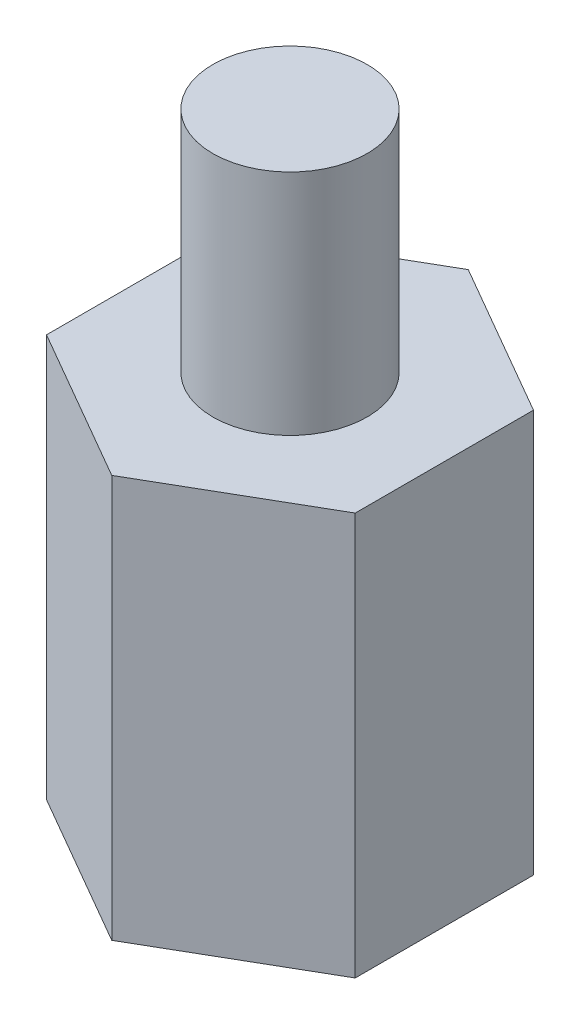
ISO-10303-21;
HEADER;
FILE_DESCRIPTION(('STEP AP214'),'2;1');
FILE_NAME('part.step','',(''),(''),'','','');
FILE_SCHEMA(('AUTOMOTIVE_DESIGN { 1 0 10303 214 1 1 1 1 }'));
ENDSEC;
DATA;
#1=APPLICATION_CONTEXT('core data for automotive mechanical design processes');
#2=APPLICATION_PROTOCOL_DEFINITION('international standard','automotive_design',2000,#1);
#3=PRODUCT_CONTEXT('',#1,'mechanical');
#4=PRODUCT('Part','Part','',(#3));
#5=PRODUCT_RELATED_PRODUCT_CATEGORY('part','',(#4));
#6=PRODUCT_DEFINITION_FORMATION('','',#4);
#7=PRODUCT_DEFINITION_CONTEXT('part definition',#1,'design');
#8=PRODUCT_DEFINITION('design','',#6,#7);
#9=PRODUCT_DEFINITION_SHAPE('','',#8);
#10=(LENGTH_UNIT() NAMED_UNIT(*) SI_UNIT(.MILLI.,.METRE.));
#11=(NAMED_UNIT(*) PLANE_ANGLE_UNIT() SI_UNIT($,.RADIAN.));
#12=(NAMED_UNIT(*) SI_UNIT($,.STERADIAN.) SOLID_ANGLE_UNIT());
#13=UNCERTAINTY_MEASURE_WITH_UNIT(LENGTH_MEASURE(1.E-05),#10,'distance_accuracy_value','');
#14=(GEOMETRIC_REPRESENTATION_CONTEXT(3) GLOBAL_UNCERTAINTY_ASSIGNED_CONTEXT((#13)) GLOBAL_UNIT_ASSIGNED_CONTEXT((#10,
#11,#12)) REPRESENTATION_CONTEXT('',''));
#15=CARTESIAN_POINT('',(0.,0.,0.));
#16=DIRECTION('',(0.,0.,1.));
#17=DIRECTION('',(1.,0.,0.));
#18=AXIS2_PLACEMENT_3D('',#15,#16,#17);
#19=CARTESIAN_POINT('',(2.29999999999999,6.,-1.32790561913617));
#20=DIRECTION('',(-0.499999999999995,0.,0.866025403784441));
#21=DIRECTION('',(0.866025403784442,0.,0.499999999999995));
#22=AXIS2_PLACEMENT_3D('',#19,#20,#21);
#23=PLANE('',#22);
#24=DIRECTION('',(-0.866025403784442,0.,-0.499999999999995));
#25=VECTOR('',#24,1.);
#26=CARTESIAN_POINT('',(2.29999999999999,0.,-1.32790561913617));
#27=LINE('',#26,#25);
#28=CARTESIAN_POINT('',(2.29999999999999,0.,-1.32790561913617));
#29=VERTEX_POINT('',#28);
#30=CARTESIAN_POINT('',(0.,0.,-2.65581123827228));
#31=VERTEX_POINT('',#30);
#32=EDGE_CURVE('E118',#29,#31,#27,.T.);
#33=ORIENTED_EDGE('',*,*,#32,.T.);
#34=DIRECTION('',(0.,-1.,0.));
#35=VECTOR('',#34,1.);
#36=CARTESIAN_POINT('',(0.,6.,-2.65581123827228));
#37=LINE('',#36,#35);
#38=CARTESIAN_POINT('',(0.,6.,-2.65581123827228));
#39=VERTEX_POINT('',#38);
#40=EDGE_CURVE('E11',#39,#31,#37,.T.);
#41=ORIENTED_EDGE('',*,*,#40,.F.);
#42=DIRECTION('',(-0.866025403784442,0.,-0.499999999999995));
#43=VECTOR('',#42,1.);
#44=CARTESIAN_POINT('',(2.29999999999999,6.,-1.32790561913617));
#45=LINE('',#44,#43);
#46=CARTESIAN_POINT('',(2.29999999999999,6.,-1.32790561913617));
#47=VERTEX_POINT('',#46);
#48=EDGE_CURVE('E129',#47,#39,#45,.T.);
#49=ORIENTED_EDGE('',*,*,#48,.F.);
#50=DIRECTION('',(0.,-1.,0.));
#51=VECTOR('',#50,1.);
#52=CARTESIAN_POINT('',(2.29999999999999,6.,-1.32790561913617));
#53=LINE('',#52,#51);
#54=EDGE_CURVE('E114',#47,#29,#53,.T.);
#55=ORIENTED_EDGE('',*,*,#54,.T.);
#56=EDGE_LOOP('',(#33,#41,#49,#55));
#57=FACE_BOUND('',#56,.T.);
#58=ADVANCED_FACE('F34',(#57),#23,.F.);
#59=CARTESIAN_POINT('',(0.,6.,-2.65581123827228));
#60=DIRECTION('',(0.500000000000001,0.,0.866025403784438));
#61=DIRECTION('',(0.866025403784438,0.,-0.500000000000001));
#62=AXIS2_PLACEMENT_3D('',#59,#60,#61);
#63=PLANE('',#62);
#64=DIRECTION('',(-0.866025403784438,0.,0.500000000000001));
#65=VECTOR('',#64,1.);
#66=CARTESIAN_POINT('',(0.,0.,-2.65581123827228));
#67=LINE('',#66,#65);
#68=CARTESIAN_POINT('',(-2.3,0.,-1.32790561913613));
#69=VERTEX_POINT('',#68);
#70=EDGE_CURVE('E121',#31,#69,#67,.T.);
#71=ORIENTED_EDGE('',*,*,#70,.T.);
#72=DIRECTION('',(0.,-1.,0.));
#73=VECTOR('',#72,1.);
#74=CARTESIAN_POINT('',(-2.3,6.,-1.32790561913613));
#75=LINE('',#74,#73);
#76=CARTESIAN_POINT('',(-2.3,6.,-1.32790561913613));
#77=VERTEX_POINT('',#76);
#78=EDGE_CURVE('E42',#77,#69,#75,.T.);
#79=ORIENTED_EDGE('',*,*,#78,.F.);
#80=DIRECTION('',(-0.866025403784438,0.,0.500000000000001));
#81=VECTOR('',#80,1.);
#82=CARTESIAN_POINT('',(0.,6.,-2.65581123827228));
#83=LINE('',#82,#81);
#84=EDGE_CURVE('E87',#39,#77,#83,.T.);
#85=ORIENTED_EDGE('',*,*,#84,.F.);
#86=ORIENTED_EDGE('',*,*,#40,.T.);
#87=EDGE_LOOP('',(#71,#79,#85,#86));
#88=FACE_BOUND('',#87,.T.);
#89=ADVANCED_FACE('F154',(#88),#63,.F.);
#90=CARTESIAN_POINT('',(-2.3,6.,-1.32790561913613));
#91=DIRECTION('',(1.,0.,0.));
#92=DIRECTION('',(0.,0.,-1.));
#93=AXIS2_PLACEMENT_3D('',#90,#91,#92);
#94=PLANE('',#93);
#95=DIRECTION('',(0.,0.,1.));
#96=VECTOR('',#95,1.);
#97=CARTESIAN_POINT('',(-2.3,0.,-1.32790561913613));
#98=LINE('',#97,#96);
#99=CARTESIAN_POINT('',(-2.3,0.,1.32790561913615));
#100=VERTEX_POINT('',#99);
#101=EDGE_CURVE('E124',#69,#100,#98,.T.);
#102=ORIENTED_EDGE('',*,*,#101,.T.);
#103=DIRECTION('',(0.,-1.,0.));
#104=VECTOR('',#103,1.);
#105=CARTESIAN_POINT('',(-2.3,6.,1.32790561913615));
#106=LINE('',#105,#104);
#107=CARTESIAN_POINT('',(-2.3,6.,1.32790561913615));
#108=VERTEX_POINT('',#107);
#109=EDGE_CURVE('E109',#108,#100,#106,.T.);
#110=ORIENTED_EDGE('',*,*,#109,.F.);
#111=DIRECTION('',(0.,0.,1.));
#112=VECTOR('',#111,1.);
#113=CARTESIAN_POINT('',(-2.3,6.,-1.32790561913613));
#114=LINE('',#113,#112);
#115=EDGE_CURVE('E100',#77,#108,#114,.T.);
#116=ORIENTED_EDGE('',*,*,#115,.F.);
#117=ORIENTED_EDGE('',*,*,#78,.T.);
#118=EDGE_LOOP('',(#102,#110,#116,#117));
#119=FACE_BOUND('',#118,.T.);
#120=ADVANCED_FACE('F135',(#119),#94,.F.);
#121=CARTESIAN_POINT('',(-2.3,6.,1.32790561913615));
#122=DIRECTION('',(0.499999999999995,0.,-0.866025403784442));
#123=DIRECTION('',(-0.866025403784442,0.,-0.499999999999995));
#124=AXIS2_PLACEMENT_3D('',#121,#122,#123);
#125=PLANE('',#124);
#126=DIRECTION('',(0.866025403784441,0.,0.499999999999995));
#127=VECTOR('',#126,1.);
#128=CARTESIAN_POINT('',(-2.3,0.,1.32790561913615));
#129=LINE('',#128,#127);
#130=CARTESIAN_POINT('',(0.,0.,2.65581123827228));
#131=VERTEX_POINT('',#130);
#132=EDGE_CURVE('E108',#100,#131,#129,.T.);
#133=ORIENTED_EDGE('',*,*,#132,.T.);
#134=DIRECTION('',(0.,-1.,0.));
#135=VECTOR('',#134,1.);
#136=CARTESIAN_POINT('',(0.,6.,2.65581123827228));
#137=LINE('',#136,#135);
#138=CARTESIAN_POINT('',(0.,6.,2.65581123827228));
#139=VERTEX_POINT('',#138);
#140=EDGE_CURVE('E105',#139,#131,#137,.T.);
#141=ORIENTED_EDGE('',*,*,#140,.F.);
#142=DIRECTION('',(0.866025403784441,0.,0.499999999999995));
#143=VECTOR('',#142,1.);
#144=CARTESIAN_POINT('',(-2.3,6.,1.32790561913615));
#145=LINE('',#144,#143);
#146=EDGE_CURVE('E94',#108,#139,#145,.T.);
#147=ORIENTED_EDGE('',*,*,#146,.F.);
#148=ORIENTED_EDGE('',*,*,#109,.T.);
#149=EDGE_LOOP('',(#133,#141,#147,#148));
#150=FACE_BOUND('',#149,.T.);
#151=ADVANCED_FACE('F106',(#150),#125,.F.);
#152=CARTESIAN_POINT('',(0.,6.,2.65581123827228));
#153=DIRECTION('',(-0.500000000000007,0.,-0.866025403784435));
#154=DIRECTION('',(-0.866025403784434,0.,0.500000000000007));
#155=AXIS2_PLACEMENT_3D('',#152,#153,#154);
#156=PLANE('',#155);
#157=DIRECTION('',(0.866025403784435,0.,-0.500000000000007));
#158=VECTOR('',#157,1.);
#159=CARTESIAN_POINT('',(0.,0.,2.65581123827228));
#160=LINE('',#159,#158);
#161=CARTESIAN_POINT('',(2.30000000000001,0.,1.32790561913612));
#162=VERTEX_POINT('',#161);
#163=EDGE_CURVE('E73',#131,#162,#160,.T.);
#164=ORIENTED_EDGE('',*,*,#163,.T.);
#165=DIRECTION('',(0.,-1.,0.));
#166=VECTOR('',#165,1.);
#167=CARTESIAN_POINT('',(2.30000000000001,6.,1.32790561913612));
#168=LINE('',#167,#166);
#169=CARTESIAN_POINT('',(2.30000000000001,6.,1.32790561913612));
#170=VERTEX_POINT('',#169);
#171=EDGE_CURVE('E110',#170,#162,#168,.T.);
#172=ORIENTED_EDGE('',*,*,#171,.F.);
#173=DIRECTION('',(0.866025403784435,0.,-0.500000000000007));
#174=VECTOR('',#173,1.);
#175=CARTESIAN_POINT('',(0.,6.,2.65581123827228));
#176=LINE('',#175,#174);
#177=EDGE_CURVE('E98',#139,#170,#176,.T.);
#178=ORIENTED_EDGE('',*,*,#177,.F.);
#179=ORIENTED_EDGE('',*,*,#140,.T.);
#180=EDGE_LOOP('',(#164,#172,#178,#179));
#181=FACE_BOUND('',#180,.T.);
#182=ADVANCED_FACE('F112',(#181),#156,.F.);
#183=CARTESIAN_POINT('',(2.30000000000001,6.,1.32790561913612));
#184=DIRECTION('',(-1.,0.,0.));
#185=DIRECTION('',(0.,0.,1.));
#186=AXIS2_PLACEMENT_3D('',#183,#184,#185);
#187=PLANE('',#186);
#188=DIRECTION('',(0.,0.,-1.));
#189=VECTOR('',#188,1.);
#190=CARTESIAN_POINT('',(2.30000000000001,0.,1.32790561913612));
#191=LINE('',#190,#189);
#192=EDGE_CURVE('E79',#162,#29,#191,.T.);
#193=ORIENTED_EDGE('',*,*,#192,.T.);
#194=ORIENTED_EDGE('',*,*,#54,.F.);
#195=DIRECTION('',(0.,0.,-1.));
#196=VECTOR('',#195,1.);
#197=CARTESIAN_POINT('',(2.30000000000001,6.,1.32790561913612));
#198=LINE('',#197,#196);
#199=EDGE_CURVE('E50',#170,#47,#198,.T.);
#200=ORIENTED_EDGE('',*,*,#199,.F.);
#201=ORIENTED_EDGE('',*,*,#171,.T.);
#202=EDGE_LOOP('',(#193,#194,#200,#201));
#203=FACE_BOUND('',#202,.T.);
#204=ADVANCED_FACE('F142',(#203),#187,.F.);
#205=CARTESIAN_POINT('',(0.,6.,0.));
#206=DIRECTION('',(0.,1.,0.));
#207=DIRECTION('',(0.,0.,1.));
#208=AXIS2_PLACEMENT_3D('',#205,#206,#207);
#209=PLANE('',#208);
#210=CARTESIAN_POINT('',(0.,6.,0.));
#211=DIRECTION('',(0.,1.,0.));
#212=DIRECTION('',(0.,0.,1.));
#213=AXIS2_PLACEMENT_3D('',#210,#211,#212);
#214=CIRCLE('',#213,1.15);
#215=CARTESIAN_POINT('',(0.,6.,1.15));
#216=VERTEX_POINT('',#215);
#217=EDGE_CURVE('E237',#216,#216,#214,.T.);
#218=ORIENTED_EDGE('',*,*,#217,.F.);
#219=EDGE_LOOP('',(#218));
#220=FACE_BOUND('',#219,.T.);
#221=ORIENTED_EDGE('',*,*,#48,.T.);
#222=ORIENTED_EDGE('',*,*,#84,.T.);
#223=ORIENTED_EDGE('',*,*,#115,.T.);
#224=ORIENTED_EDGE('',*,*,#146,.T.);
#225=ORIENTED_EDGE('',*,*,#177,.T.);
#226=ORIENTED_EDGE('',*,*,#199,.T.);
#227=EDGE_LOOP('',(#221,#222,#223,#224,#225,#226));
#228=FACE_BOUND('',#227,.T.);
#229=ADVANCED_FACE('F96',(#220,#228),#209,.T.);
#230=CARTESIAN_POINT('',(0.,0.,0.));
#231=DIRECTION('',(0.,1.,0.));
#232=DIRECTION('',(0.,0.,1.));
#233=AXIS2_PLACEMENT_3D('',#230,#231,#232);
#234=PLANE('',#233);
#235=CARTESIAN_POINT('',(0.,0.,0.));
#236=DIRECTION('',(0.,-1.,0.));
#237=DIRECTION('',(0.,0.,-1.));
#238=AXIS2_PLACEMENT_3D('',#235,#236,#237);
#239=CIRCLE('',#238,1.35);
#240=CARTESIAN_POINT('',(0.,0.,-1.35));
#241=VERTEX_POINT('',#240);
#242=EDGE_CURVE('E238',#241,#241,#239,.T.);
#243=ORIENTED_EDGE('',*,*,#242,.F.);
#244=EDGE_LOOP('',(#243));
#245=FACE_BOUND('',#244,.T.);
#246=ORIENTED_EDGE('',*,*,#32,.F.);
#247=ORIENTED_EDGE('',*,*,#192,.F.);
#248=ORIENTED_EDGE('',*,*,#163,.F.);
#249=ORIENTED_EDGE('',*,*,#132,.F.);
#250=ORIENTED_EDGE('',*,*,#101,.F.);
#251=ORIENTED_EDGE('',*,*,#70,.F.);
#252=EDGE_LOOP('',(#246,#247,#248,#249,#250,#251));
#253=FACE_BOUND('',#252,.T.);
#254=ADVANCED_FACE('F138',(#245,#253),#234,.F.);
#255=CARTESIAN_POINT('',(0.,9.4,0.));
#256=DIRECTION('',(0.,-1.,0.));
#257=DIRECTION('',(0.,0.,-1.));
#258=AXIS2_PLACEMENT_3D('',#255,#256,#257);
#259=CYLINDRICAL_SURFACE('',#258,1.15);
#260=CARTESIAN_POINT('',(0.,9.4,0.));
#261=DIRECTION('',(0.,1.,0.));
#262=DIRECTION('',(0.,0.,1.));
#263=AXIS2_PLACEMENT_3D('',#260,#261,#262);
#264=CIRCLE('',#263,1.15);
#265=CARTESIAN_POINT('',(0.,9.4,1.15));
#266=VERTEX_POINT('',#265);
#267=EDGE_CURVE('E122',#266,#266,#264,.T.);
#268=ORIENTED_EDGE('',*,*,#267,.F.);
#269=EDGE_LOOP('',(#268));
#270=FACE_BOUND('',#269,.T.);
#271=ORIENTED_EDGE('',*,*,#217,.T.);
#272=EDGE_LOOP('',(#271));
#273=FACE_BOUND('',#272,.T.);
#274=ADVANCED_FACE('F189',(#270,#273),#259,.T.);
#275=CARTESIAN_POINT('',(0.,9.4,0.));
#276=DIRECTION('',(0.,1.,0.));
#277=DIRECTION('',(0.,0.,1.));
#278=AXIS2_PLACEMENT_3D('',#275,#276,#277);
#279=PLANE('',#278);
#280=ORIENTED_EDGE('',*,*,#267,.T.);
#281=EDGE_LOOP('',(#280));
#282=FACE_BOUND('',#281,.T.);
#283=ADVANCED_FACE('F194',(#282),#279,.T.);
#284=CARTESIAN_POINT('',(0.,4.,0.));
#285=DIRECTION('',(0.,-1.,0.));
#286=DIRECTION('',(0.,0.,-1.));
#287=AXIS2_PLACEMENT_3D('',#284,#285,#286);
#288=CYLINDRICAL_SURFACE('',#287,1.35);
#289=CARTESIAN_POINT('',(0.,4.,0.));
#290=DIRECTION('',(0.,-1.,0.));
#291=DIRECTION('',(0.,0.,-1.));
#292=AXIS2_PLACEMENT_3D('',#289,#290,#291);
#293=CIRCLE('',#292,1.35);
#294=CARTESIAN_POINT('',(0.,4.,-1.35));
#295=VERTEX_POINT('',#294);
#296=EDGE_CURVE('E236',#295,#295,#293,.T.);
#297=ORIENTED_EDGE('',*,*,#296,.F.);
#298=EDGE_LOOP('',(#297));
#299=FACE_BOUND('',#298,.T.);
#300=ORIENTED_EDGE('',*,*,#242,.T.);
#301=EDGE_LOOP('',(#300));
#302=FACE_BOUND('',#301,.T.);
#303=ADVANCED_FACE('F204',(#299,#302),#288,.F.);
#304=CARTESIAN_POINT('',(0.,4.,0.));
#305=DIRECTION('',(0.,-1.,0.));
#306=DIRECTION('',(0.,0.,-1.));
#307=AXIS2_PLACEMENT_3D('',#304,#305,#306);
#308=PLANE('',#307);
#309=ORIENTED_EDGE('',*,*,#296,.T.);
#310=EDGE_LOOP('',(#309));
#311=FACE_BOUND('',#310,.T.);
#312=ADVANCED_FACE('F220',(#311),#308,.T.);
#313=CLOSED_SHELL('',(#58,#89,#120,#151,#182,#204,#229,#254,#274,#283,#303,#312));
#314=MANIFOLD_SOLID_BREP('B2',#313);
#315=ADVANCED_BREP_SHAPE_REPRESENTATION('',(#18,#314),#14);
#316=SHAPE_DEFINITION_REPRESENTATION(#9,#315);
ENDSEC;
END-ISO-10303-21;
